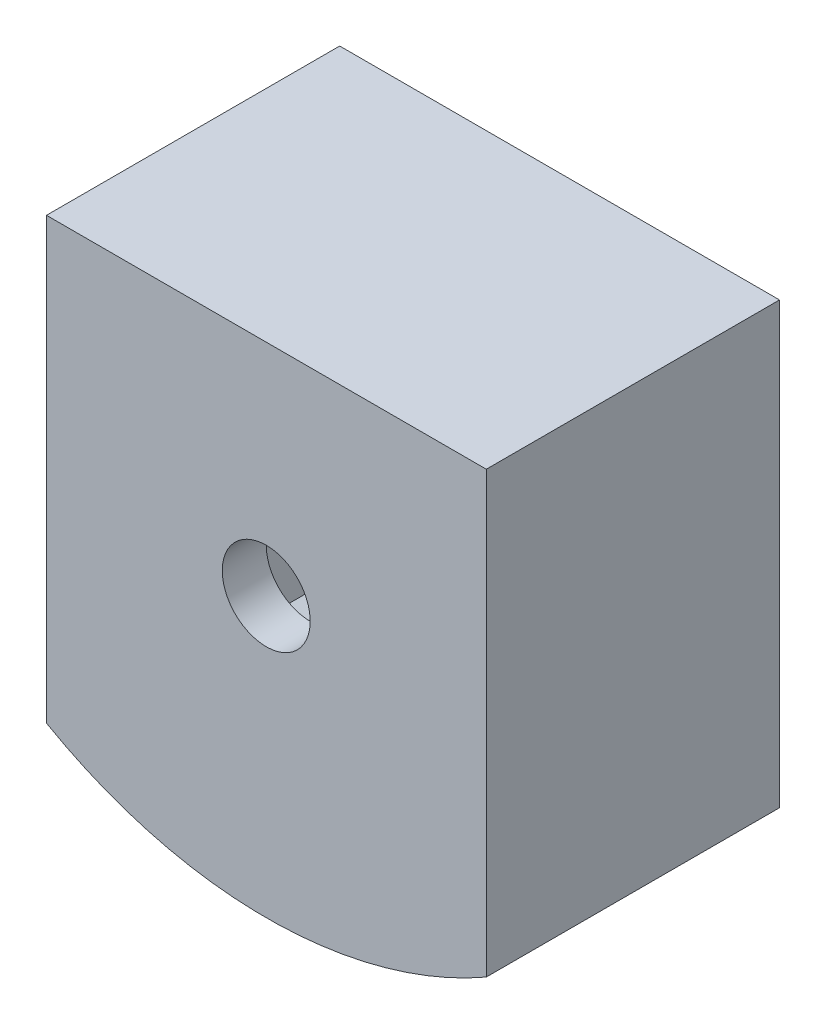
ISO-10303-21;
HEADER;
FILE_DESCRIPTION(('STEP AP214'),'2;1');
FILE_NAME('part.step','',(''),(''),'','','');
FILE_SCHEMA(('AUTOMOTIVE_DESIGN { 1 0 10303 214 1 1 1 1 }'));
ENDSEC;
DATA;
#1=APPLICATION_CONTEXT('core data for automotive mechanical design processes');
#2=APPLICATION_PROTOCOL_DEFINITION('international standard','automotive_design',2000,#1);
#3=PRODUCT_CONTEXT('',#1,'mechanical');
#4=PRODUCT('Part','Part','',(#3));
#5=PRODUCT_RELATED_PRODUCT_CATEGORY('part','',(#4));
#6=PRODUCT_DEFINITION_FORMATION('','',#4);
#7=PRODUCT_DEFINITION_CONTEXT('part definition',#1,'design');
#8=PRODUCT_DEFINITION('design','',#6,#7);
#9=PRODUCT_DEFINITION_SHAPE('','',#8);
#10=(LENGTH_UNIT() NAMED_UNIT(*) SI_UNIT(.MILLI.,.METRE.));
#11=(NAMED_UNIT(*) PLANE_ANGLE_UNIT() SI_UNIT($,.RADIAN.));
#12=(NAMED_UNIT(*) SI_UNIT($,.STERADIAN.) SOLID_ANGLE_UNIT());
#13=UNCERTAINTY_MEASURE_WITH_UNIT(LENGTH_MEASURE(1.E-05),#10,'distance_accuracy_value','');
#14=(GEOMETRIC_REPRESENTATION_CONTEXT(3) GLOBAL_UNCERTAINTY_ASSIGNED_CONTEXT((#13)) GLOBAL_UNIT_ASSIGNED_CONTEXT((#10,
#11,#12)) REPRESENTATION_CONTEXT('',''));
#15=CARTESIAN_POINT('',(0.,0.,0.));
#16=DIRECTION('',(0.,0.,1.));
#17=DIRECTION('',(1.,0.,0.));
#18=AXIS2_PLACEMENT_3D('',#15,#16,#17);
#19=CARTESIAN_POINT('',(-15.,-15.,20.));
#20=DIRECTION('',(1.,0.,0.));
#21=DIRECTION('',(0.,1.,0.));
#22=AXIS2_PLACEMENT_3D('',#19,#20,#21);
#23=PLANE('',#22);
#24=DIRECTION('',(0.,-1.,0.));
#25=VECTOR('',#24,1.);
#26=CARTESIAN_POINT('',(-15.,-15.,0.));
#27=LINE('',#26,#25);
#28=CARTESIAN_POINT('',(-15.,15.,0.));
#29=VERTEX_POINT('',#28);
#30=CARTESIAN_POINT('',(-15.,-15.,0.));
#31=VERTEX_POINT('',#30);
#32=EDGE_CURVE('E349',#29,#31,#27,.T.);
#33=ORIENTED_EDGE('',*,*,#32,.T.);
#34=DIRECTION('',(0.,0.,-1.));
#35=VECTOR('',#34,1.);
#36=CARTESIAN_POINT('',(-15.,-15.,20.));
#37=LINE('',#36,#35);
#38=CARTESIAN_POINT('',(-15.,-15.,20.));
#39=VERTEX_POINT('',#38);
#40=EDGE_CURVE('E13',#39,#31,#37,.T.);
#41=ORIENTED_EDGE('',*,*,#40,.F.);
#42=DIRECTION('',(0.,-1.,0.));
#43=VECTOR('',#42,1.);
#44=CARTESIAN_POINT('',(-15.,-15.,20.));
#45=LINE('',#44,#43);
#46=CARTESIAN_POINT('',(-15.,15.,20.));
#47=VERTEX_POINT('',#46);
#48=EDGE_CURVE('E377',#47,#39,#45,.T.);
#49=ORIENTED_EDGE('',*,*,#48,.F.);
#50=DIRECTION('',(0.,0.,-1.));
#51=VECTOR('',#50,1.);
#52=CARTESIAN_POINT('',(-15.,15.,20.));
#53=LINE('',#52,#51);
#54=EDGE_CURVE('E387',#47,#29,#53,.T.);
#55=ORIENTED_EDGE('',*,*,#54,.T.);
#56=EDGE_LOOP('',(#33,#41,#49,#55));
#57=FACE_BOUND('',#56,.T.);
#58=ADVANCED_FACE('F47',(#57),#23,.F.);
#59=CARTESIAN_POINT('',(0.,11.0897908705464,20.));
#60=DIRECTION('',(0.,0.,-1.));
#61=DIRECTION('',(-1.,0.,0.));
#62=AXIS2_PLACEMENT_3D('',#59,#60,#61);
#63=CYLINDRICAL_SURFACE('',#62,30.0944710481651);
#64=CARTESIAN_POINT('',(0.,11.0897908705464,0.));
#65=DIRECTION('',(0.,0.,1.));
#66=DIRECTION('',(1.,0.,0.));
#67=AXIS2_PLACEMENT_3D('',#64,#65,#66);
#68=CIRCLE('',#67,30.0944710481651);
#69=CARTESIAN_POINT('',(15.,-15.,0.));
#70=VERTEX_POINT('',#69);
#71=EDGE_CURVE('E390',#31,#70,#68,.T.);
#72=ORIENTED_EDGE('',*,*,#71,.T.);
#73=DIRECTION('',(0.,0.,-1.));
#74=VECTOR('',#73,1.);
#75=CARTESIAN_POINT('',(15.,-15.,20.));
#76=LINE('',#75,#74);
#77=CARTESIAN_POINT('',(15.,-15.,20.));
#78=VERTEX_POINT('',#77);
#79=EDGE_CURVE('E54',#78,#70,#76,.T.);
#80=ORIENTED_EDGE('',*,*,#79,.F.);
#81=CARTESIAN_POINT('',(0.,11.0897908705464,20.));
#82=DIRECTION('',(0.,0.,1.));
#83=DIRECTION('',(1.,0.,0.));
#84=AXIS2_PLACEMENT_3D('',#81,#82,#83);
#85=CIRCLE('',#84,30.0944710481651);
#86=EDGE_CURVE('E380',#39,#78,#85,.T.);
#87=ORIENTED_EDGE('',*,*,#86,.F.);
#88=ORIENTED_EDGE('',*,*,#40,.T.);
#89=EDGE_LOOP('',(#72,#80,#87,#88));
#90=FACE_BOUND('',#89,.T.);
#91=ADVANCED_FACE('F420',(#90),#63,.T.);
#92=CARTESIAN_POINT('',(15.,-15.,20.));
#93=DIRECTION('',(-1.,0.,0.));
#94=DIRECTION('',(0.,-1.,0.));
#95=AXIS2_PLACEMENT_3D('',#92,#93,#94);
#96=PLANE('',#95);
#97=DIRECTION('',(0.,1.,0.));
#98=VECTOR('',#97,1.);
#99=CARTESIAN_POINT('',(15.,-15.,0.));
#100=LINE('',#99,#98);
#101=CARTESIAN_POINT('',(15.,15.,0.));
#102=VERTEX_POINT('',#101);
#103=EDGE_CURVE('E392',#70,#102,#100,.T.);
#104=ORIENTED_EDGE('',*,*,#103,.T.);
#105=DIRECTION('',(0.,0.,-1.));
#106=VECTOR('',#105,1.);
#107=CARTESIAN_POINT('',(15.,15.,20.));
#108=LINE('',#107,#106);
#109=CARTESIAN_POINT('',(15.,15.,20.));
#110=VERTEX_POINT('',#109);
#111=EDGE_CURVE('E397',#110,#102,#108,.T.);
#112=ORIENTED_EDGE('',*,*,#111,.F.);
#113=DIRECTION('',(0.,1.,0.));
#114=VECTOR('',#113,1.);
#115=CARTESIAN_POINT('',(15.,-15.,20.));
#116=LINE('',#115,#114);
#117=EDGE_CURVE('E383',#78,#110,#116,.T.);
#118=ORIENTED_EDGE('',*,*,#117,.F.);
#119=ORIENTED_EDGE('',*,*,#79,.T.);
#120=EDGE_LOOP('',(#104,#112,#118,#119));
#121=FACE_BOUND('',#120,.T.);
#122=ADVANCED_FACE('F404',(#121),#96,.F.);
#123=CARTESIAN_POINT('',(15.,15.,20.));
#124=DIRECTION('',(0.,-1.,0.));
#125=DIRECTION('',(0.,0.,-1.));
#126=AXIS2_PLACEMENT_3D('',#123,#124,#125);
#127=PLANE('',#126);
#128=DIRECTION('',(-1.,0.,0.));
#129=VECTOR('',#128,1.);
#130=CARTESIAN_POINT('',(15.,15.,0.));
#131=LINE('',#130,#129);
#132=EDGE_CURVE('E381',#102,#29,#131,.T.);
#133=ORIENTED_EDGE('',*,*,#132,.T.);
#134=ORIENTED_EDGE('',*,*,#54,.F.);
#135=DIRECTION('',(-1.,0.,0.));
#136=VECTOR('',#135,1.);
#137=CARTESIAN_POINT('',(15.,15.,20.));
#138=LINE('',#137,#136);
#139=EDGE_CURVE('E385',#110,#47,#138,.T.);
#140=ORIENTED_EDGE('',*,*,#139,.F.);
#141=ORIENTED_EDGE('',*,*,#111,.T.);
#142=EDGE_LOOP('',(#133,#134,#140,#141));
#143=FACE_BOUND('',#142,.T.);
#144=ADVANCED_FACE('F413',(#143),#127,.F.);
#145=CARTESIAN_POINT('',(0.,11.0897908705464,20.));
#146=DIRECTION('',(0.,0.,1.));
#147=DIRECTION('',(1.,0.,0.));
#148=AXIS2_PLACEMENT_3D('',#145,#146,#147);
#149=PLANE('',#148);
#150=CARTESIAN_POINT('',(-0.0102597379063596,0.00757269740248034,20.));
#151=DIRECTION('',(0.,0.,-1.));
#152=DIRECTION('',(-1.,0.,0.));
#153=AXIS2_PLACEMENT_3D('',#150,#151,#152);
#154=CIRCLE('',#153,3.);
#155=CARTESIAN_POINT('',(-3.01025973790636,0.00757269740248034,20.));
#156=VERTEX_POINT('',#155);
#157=EDGE_CURVE('E340',#156,#156,#154,.T.);
#158=ORIENTED_EDGE('',*,*,#157,.T.);
#159=EDGE_LOOP('',(#158));
#160=FACE_BOUND('',#159,.T.);
#161=ORIENTED_EDGE('',*,*,#48,.T.);
#162=ORIENTED_EDGE('',*,*,#86,.T.);
#163=ORIENTED_EDGE('',*,*,#117,.T.);
#164=ORIENTED_EDGE('',*,*,#139,.T.);
#165=EDGE_LOOP('',(#161,#162,#163,#164));
#166=FACE_BOUND('',#165,.T.);
#167=ADVANCED_FACE('F419',(#160,#166),#149,.T.);
#168=CARTESIAN_POINT('',(0.,11.0897908705464,0.));
#169=DIRECTION('',(0.,0.,1.));
#170=DIRECTION('',(1.,0.,0.));
#171=AXIS2_PLACEMENT_3D('',#168,#169,#170);
#172=PLANE('',#171);
#173=DIRECTION('',(-1.,0.,0.));
#174=VECTOR('',#173,1.);
#175=CARTESIAN_POINT('',(5.,13.,0.));
#176=LINE('',#175,#174);
#177=CARTESIAN_POINT('',(5.,13.,0.));
#178=VERTEX_POINT('',#177);
#179=CARTESIAN_POINT('',(-5.,13.,0.));
#180=VERTEX_POINT('',#179);
#181=EDGE_CURVE('E236',#178,#180,#176,.T.);
#182=ORIENTED_EDGE('',*,*,#181,.F.);
#183=DIRECTION('',(0.,-1.,0.));
#184=VECTOR('',#183,1.);
#185=CARTESIAN_POINT('',(5.,14.,0.));
#186=LINE('',#185,#184);
#187=CARTESIAN_POINT('',(5.,14.,0.));
#188=VERTEX_POINT('',#187);
#189=EDGE_CURVE('E61',#188,#178,#186,.T.);
#190=ORIENTED_EDGE('',*,*,#189,.F.);
#191=DIRECTION('',(1.,0.,0.));
#192=VECTOR('',#191,1.);
#193=CARTESIAN_POINT('',(5.,14.,0.));
#194=LINE('',#193,#192);
#195=CARTESIAN_POINT('',(-5.,14.,0.));
#196=VERTEX_POINT('',#195);
#197=EDGE_CURVE('E227',#196,#188,#194,.T.);
#198=ORIENTED_EDGE('',*,*,#197,.F.);
#199=DIRECTION('',(0.,1.,0.));
#200=VECTOR('',#199,1.);
#201=CARTESIAN_POINT('',(-5.,14.,0.));
#202=LINE('',#201,#200);
#203=EDGE_CURVE('E230',#180,#196,#202,.T.);
#204=ORIENTED_EDGE('',*,*,#203,.F.);
#205=EDGE_LOOP('',(#182,#190,#198,#204));
#206=FACE_BOUND('',#205,.T.);
#207=DIRECTION('',(-1.,0.,0.));
#208=VECTOR('',#207,1.);
#209=CARTESIAN_POINT('',(14.,-5.,0.));
#210=LINE('',#209,#208);
#211=CARTESIAN_POINT('',(14.,-5.,0.));
#212=VERTEX_POINT('',#211);
#213=CARTESIAN_POINT('',(13.,-5.,0.));
#214=VERTEX_POINT('',#213);
#215=EDGE_CURVE('E262',#212,#214,#210,.T.);
#216=ORIENTED_EDGE('',*,*,#215,.F.);
#217=DIRECTION('',(0.,-1.,0.));
#218=VECTOR('',#217,1.);
#219=CARTESIAN_POINT('',(14.,5.,0.));
#220=LINE('',#219,#218);
#221=CARTESIAN_POINT('',(14.,5.,0.));
#222=VERTEX_POINT('',#221);
#223=EDGE_CURVE('E69',#222,#212,#220,.T.);
#224=ORIENTED_EDGE('',*,*,#223,.F.);
#225=DIRECTION('',(1.,0.,0.));
#226=VECTOR('',#225,1.);
#227=CARTESIAN_POINT('',(14.,5.,0.));
#228=LINE('',#227,#226);
#229=CARTESIAN_POINT('',(13.,5.,0.));
#230=VERTEX_POINT('',#229);
#231=EDGE_CURVE('E251',#230,#222,#228,.T.);
#232=ORIENTED_EDGE('',*,*,#231,.F.);
#233=DIRECTION('',(0.,1.,0.));
#234=VECTOR('',#233,1.);
#235=CARTESIAN_POINT('',(13.,5.,0.));
#236=LINE('',#235,#234);
#237=EDGE_CURVE('E266',#214,#230,#236,.T.);
#238=ORIENTED_EDGE('',*,*,#237,.F.);
#239=EDGE_LOOP('',(#216,#224,#232,#238));
#240=FACE_BOUND('',#239,.T.);
#241=DIRECTION('',(-1.,0.,0.));
#242=VECTOR('',#241,1.);
#243=CARTESIAN_POINT('',(3.5,-18.,0.));
#244=LINE('',#243,#242);
#245=CARTESIAN_POINT('',(3.5,-18.,0.));
#246=VERTEX_POINT('',#245);
#247=CARTESIAN_POINT('',(-3.5,-18.,0.));
#248=VERTEX_POINT('',#247);
#249=EDGE_CURVE('E293',#246,#248,#244,.T.);
#250=ORIENTED_EDGE('',*,*,#249,.F.);
#251=DIRECTION('',(0.,-1.,0.));
#252=VECTOR('',#251,1.);
#253=CARTESIAN_POINT('',(3.5,-17.,0.));
#254=LINE('',#253,#252);
#255=CARTESIAN_POINT('',(3.5,-17.,0.));
#256=VERTEX_POINT('',#255);
#257=EDGE_CURVE('E291',#256,#246,#254,.T.);
#258=ORIENTED_EDGE('',*,*,#257,.F.);
#259=DIRECTION('',(1.,0.,0.));
#260=VECTOR('',#259,1.);
#261=CARTESIAN_POINT('',(3.5,-17.,0.));
#262=LINE('',#261,#260);
#263=CARTESIAN_POINT('',(-3.5,-17.,0.));
#264=VERTEX_POINT('',#263);
#265=EDGE_CURVE('E281',#264,#256,#262,.T.);
#266=ORIENTED_EDGE('',*,*,#265,.F.);
#267=DIRECTION('',(0.,1.,0.));
#268=VECTOR('',#267,1.);
#269=CARTESIAN_POINT('',(-3.5,-17.,0.));
#270=LINE('',#269,#268);
#271=EDGE_CURVE('E297',#248,#264,#270,.T.);
#272=ORIENTED_EDGE('',*,*,#271,.F.);
#273=EDGE_LOOP('',(#250,#258,#266,#272));
#274=FACE_BOUND('',#273,.T.);
#275=DIRECTION('',(-1.,0.,0.));
#276=VECTOR('',#275,1.);
#277=CARTESIAN_POINT('',(-13.,-5.,0.));
#278=LINE('',#277,#276);
#279=CARTESIAN_POINT('',(-13.,-5.,0.));
#280=VERTEX_POINT('',#279);
#281=CARTESIAN_POINT('',(-14.,-5.,0.));
#282=VERTEX_POINT('',#281);
#283=EDGE_CURVE('E325',#280,#282,#278,.T.);
#284=ORIENTED_EDGE('',*,*,#283,.F.);
#285=DIRECTION('',(0.,-1.,0.));
#286=VECTOR('',#285,1.);
#287=CARTESIAN_POINT('',(-13.,5.,0.));
#288=LINE('',#287,#286);
#289=CARTESIAN_POINT('',(-13.,5.,0.));
#290=VERTEX_POINT('',#289);
#291=EDGE_CURVE('E323',#290,#280,#288,.T.);
#292=ORIENTED_EDGE('',*,*,#291,.F.);
#293=DIRECTION('',(1.,0.,0.));
#294=VECTOR('',#293,1.);
#295=CARTESIAN_POINT('',(-13.,5.,0.));
#296=LINE('',#295,#294);
#297=CARTESIAN_POINT('',(-14.,5.,0.));
#298=VERTEX_POINT('',#297);
#299=EDGE_CURVE('E313',#298,#290,#296,.T.);
#300=ORIENTED_EDGE('',*,*,#299,.F.);
#301=DIRECTION('',(0.,1.,0.));
#302=VECTOR('',#301,1.);
#303=CARTESIAN_POINT('',(-14.,5.,0.));
#304=LINE('',#303,#302);
#305=EDGE_CURVE('E328',#282,#298,#304,.T.);
#306=ORIENTED_EDGE('',*,*,#305,.F.);
#307=EDGE_LOOP('',(#284,#292,#300,#306));
#308=FACE_BOUND('',#307,.T.);
#309=DIRECTION('',(-1.,0.,0.));
#310=VECTOR('',#309,1.);
#311=CARTESIAN_POINT('',(15.,12.,0.));
#312=LINE('',#311,#310);
#313=CARTESIAN_POINT('',(12.,12.,0.));
#314=VERTEX_POINT('',#313);
#315=CARTESIAN_POINT('',(-12.,12.,0.));
#316=VERTEX_POINT('',#315);
#317=EDGE_CURVE('E355',#314,#316,#312,.T.);
#318=ORIENTED_EDGE('',*,*,#317,.T.);
#319=DIRECTION('',(0.,-1.,0.));
#320=VECTOR('',#319,1.);
#321=CARTESIAN_POINT('',(-12.,-15.,0.));
#322=LINE('',#321,#320);
#323=CARTESIAN_POINT('',(-12.,-13.2023963792641,0.));
#324=VERTEX_POINT('',#323);
#325=EDGE_CURVE('E343',#316,#324,#322,.T.);
#326=ORIENTED_EDGE('',*,*,#325,.T.);
#327=CARTESIAN_POINT('',(0.,11.0897908705464,0.));
#328=DIRECTION('',(0.,0.,1.));
#329=DIRECTION('',(1.,0.,0.));
#330=AXIS2_PLACEMENT_3D('',#327,#328,#329);
#331=CIRCLE('',#330,27.0944710481651);
#332=CARTESIAN_POINT('',(12.,-13.2023963792641,0.));
#333=VERTEX_POINT('',#332);
#334=EDGE_CURVE('E369',#324,#333,#331,.T.);
#335=ORIENTED_EDGE('',*,*,#334,.T.);
#336=DIRECTION('',(0.,1.,0.));
#337=VECTOR('',#336,1.);
#338=CARTESIAN_POINT('',(12.,-15.,0.));
#339=LINE('',#338,#337);
#340=EDGE_CURVE('E372',#333,#314,#339,.T.);
#341=ORIENTED_EDGE('',*,*,#340,.T.);
#342=EDGE_LOOP('',(#318,#326,#335,#341));
#343=FACE_BOUND('',#342,.T.);
#344=ORIENTED_EDGE('',*,*,#32,.F.);
#345=ORIENTED_EDGE('',*,*,#132,.F.);
#346=ORIENTED_EDGE('',*,*,#103,.F.);
#347=ORIENTED_EDGE('',*,*,#71,.F.);
#348=EDGE_LOOP('',(#344,#345,#346,#347));
#349=FACE_BOUND('',#348,.T.);
#350=ADVANCED_FACE('F410',(#206,#240,#274,#308,#343,#349),#172,.F.);
#351=CARTESIAN_POINT('',(-12.,-15.,20.));
#352=DIRECTION('',(1.,0.,0.));
#353=DIRECTION('',(0.,1.,0.));
#354=AXIS2_PLACEMENT_3D('',#351,#352,#353);
#355=PLANE('',#354);
#356=ORIENTED_EDGE('',*,*,#325,.F.);
#357=DIRECTION('',(0.,0.,-1.));
#358=VECTOR('',#357,1.);
#359=CARTESIAN_POINT('',(-12.,12.,20.));
#360=LINE('',#359,#358);
#361=CARTESIAN_POINT('',(-12.,12.,17.));
#362=VERTEX_POINT('',#361);
#363=EDGE_CURVE('E356',#362,#316,#360,.T.);
#364=ORIENTED_EDGE('',*,*,#363,.F.);
#365=DIRECTION('',(0.,-1.,0.));
#366=VECTOR('',#365,1.);
#367=CARTESIAN_POINT('',(-12.,-15.,17.));
#368=LINE('',#367,#366);
#369=CARTESIAN_POINT('',(-12.,-13.2023963792641,17.));
#370=VERTEX_POINT('',#369);
#371=EDGE_CURVE('E351',#362,#370,#368,.T.);
#372=ORIENTED_EDGE('',*,*,#371,.T.);
#373=DIRECTION('',(0.,0.,-1.));
#374=VECTOR('',#373,1.);
#375=CARTESIAN_POINT('',(-12.,-13.2023963792641,17.));
#376=LINE('',#375,#374);
#377=EDGE_CURVE('E346',#370,#324,#376,.T.);
#378=ORIENTED_EDGE('',*,*,#377,.T.);
#379=EDGE_LOOP('',(#356,#364,#372,#378));
#380=FACE_BOUND('',#379,.T.);
#381=ADVANCED_FACE('F432',(#380),#355,.T.);
#382=CARTESIAN_POINT('',(0.,11.0897908705464,20.));
#383=DIRECTION('',(0.,0.,-1.));
#384=DIRECTION('',(-1.,0.,0.));
#385=AXIS2_PLACEMENT_3D('',#382,#383,#384);
#386=CYLINDRICAL_SURFACE('',#385,27.0944710481651);
#387=ORIENTED_EDGE('',*,*,#334,.F.);
#388=ORIENTED_EDGE('',*,*,#377,.F.);
#389=CARTESIAN_POINT('',(0.,11.0897908705464,17.));
#390=DIRECTION('',(0.,0.,1.));
#391=DIRECTION('',(1.,0.,0.));
#392=AXIS2_PLACEMENT_3D('',#389,#390,#391);
#393=CIRCLE('',#392,27.0944710481651);
#394=CARTESIAN_POINT('',(12.,-13.2023963792641,17.));
#395=VERTEX_POINT('',#394);
#396=EDGE_CURVE('E354',#370,#395,#393,.T.);
#397=ORIENTED_EDGE('',*,*,#396,.T.);
#398=DIRECTION('',(0.,0.,-1.));
#399=VECTOR('',#398,1.);
#400=CARTESIAN_POINT('',(12.,-13.2023963792641,17.));
#401=LINE('',#400,#399);
#402=EDGE_CURVE('E350',#395,#333,#401,.T.);
#403=ORIENTED_EDGE('',*,*,#402,.T.);
#404=EDGE_LOOP('',(#387,#388,#397,#403));
#405=FACE_BOUND('',#404,.T.);
#406=ADVANCED_FACE('F449',(#405),#386,.F.);
#407=CARTESIAN_POINT('',(12.,-15.,20.));
#408=DIRECTION('',(-1.,0.,0.));
#409=DIRECTION('',(0.,-1.,0.));
#410=AXIS2_PLACEMENT_3D('',#407,#408,#409);
#411=PLANE('',#410);
#412=ORIENTED_EDGE('',*,*,#340,.F.);
#413=ORIENTED_EDGE('',*,*,#402,.F.);
#414=DIRECTION('',(0.,1.,0.));
#415=VECTOR('',#414,1.);
#416=CARTESIAN_POINT('',(12.,-15.,17.));
#417=LINE('',#416,#415);
#418=CARTESIAN_POINT('',(12.,12.,17.));
#419=VERTEX_POINT('',#418);
#420=EDGE_CURVE('E363',#395,#419,#417,.T.);
#421=ORIENTED_EDGE('',*,*,#420,.T.);
#422=DIRECTION('',(0.,0.,-1.));
#423=VECTOR('',#422,1.);
#424=CARTESIAN_POINT('',(12.,12.,20.));
#425=LINE('',#424,#423);
#426=EDGE_CURVE('E358',#419,#314,#425,.T.);
#427=ORIENTED_EDGE('',*,*,#426,.T.);
#428=EDGE_LOOP('',(#412,#413,#421,#427));
#429=FACE_BOUND('',#428,.T.);
#430=ADVANCED_FACE('F445',(#429),#411,.T.);
#431=CARTESIAN_POINT('',(15.,12.,20.));
#432=DIRECTION('',(0.,-1.,0.));
#433=DIRECTION('',(0.,0.,-1.));
#434=AXIS2_PLACEMENT_3D('',#431,#432,#433);
#435=PLANE('',#434);
#436=ORIENTED_EDGE('',*,*,#317,.F.);
#437=ORIENTED_EDGE('',*,*,#426,.F.);
#438=DIRECTION('',(-1.,0.,0.));
#439=VECTOR('',#438,1.);
#440=CARTESIAN_POINT('',(15.,12.,17.));
#441=LINE('',#440,#439);
#442=EDGE_CURVE('E359',#419,#362,#441,.T.);
#443=ORIENTED_EDGE('',*,*,#442,.T.);
#444=ORIENTED_EDGE('',*,*,#363,.T.);
#445=EDGE_LOOP('',(#436,#437,#443,#444));
#446=FACE_BOUND('',#445,.T.);
#447=ADVANCED_FACE('F441',(#446),#435,.T.);
#448=CARTESIAN_POINT('',(0.,11.0897908705464,17.));
#449=DIRECTION('',(0.,0.,1.));
#450=DIRECTION('',(1.,0.,0.));
#451=AXIS2_PLACEMENT_3D('',#448,#449,#450);
#452=PLANE('',#451);
#453=CARTESIAN_POINT('',(-0.0102597379063596,0.00757269740248034,17.));
#454=DIRECTION('',(0.,0.,-1.));
#455=DIRECTION('',(-1.,0.,0.));
#456=AXIS2_PLACEMENT_3D('',#453,#454,#455);
#457=CIRCLE('',#456,3.);
#458=CARTESIAN_POINT('',(-3.01025973790636,0.00757269740248034,17.));
#459=VERTEX_POINT('',#458);
#460=EDGE_CURVE('E243',#459,#459,#457,.T.);
#461=ORIENTED_EDGE('',*,*,#460,.F.);
#462=EDGE_LOOP('',(#461));
#463=FACE_BOUND('',#462,.T.);
#464=ORIENTED_EDGE('',*,*,#371,.F.);
#465=ORIENTED_EDGE('',*,*,#442,.F.);
#466=ORIENTED_EDGE('',*,*,#420,.F.);
#467=ORIENTED_EDGE('',*,*,#396,.F.);
#468=EDGE_LOOP('',(#464,#465,#466,#467));
#469=FACE_BOUND('',#468,.T.);
#470=ADVANCED_FACE('F437',(#463,#469),#452,.F.);
#471=CARTESIAN_POINT('',(-0.0102597379063596,0.00757269740248034,20.));
#472=DIRECTION('',(0.,0.,-1.));
#473=DIRECTION('',(-1.,0.,0.));
#474=AXIS2_PLACEMENT_3D('',#471,#472,#473);
#475=CYLINDRICAL_SURFACE('',#474,3.);
#476=ORIENTED_EDGE('',*,*,#157,.F.);
#477=EDGE_LOOP('',(#476));
#478=FACE_BOUND('',#477,.T.);
#479=ORIENTED_EDGE('',*,*,#460,.T.);
#480=EDGE_LOOP('',(#479));
#481=FACE_BOUND('',#480,.T.);
#482=ADVANCED_FACE('F440',(#478,#481),#475,.F.);
#483=CARTESIAN_POINT('',(-13.,5.,5.));
#484=DIRECTION('',(1.,0.,0.));
#485=DIRECTION('',(0.,0.,-1.));
#486=AXIS2_PLACEMENT_3D('',#483,#484,#485);
#487=PLANE('',#486);
#488=ORIENTED_EDGE('',*,*,#291,.T.);
#489=DIRECTION('',(0.,0.,-1.));
#490=VECTOR('',#489,1.);
#491=CARTESIAN_POINT('',(-13.,-5.,5.));
#492=LINE('',#491,#490);
#493=CARTESIAN_POINT('',(-13.,-5.,5.));
#494=VERTEX_POINT('',#493);
#495=EDGE_CURVE('E322',#494,#280,#492,.T.);
#496=ORIENTED_EDGE('',*,*,#495,.F.);
#497=DIRECTION('',(0.,-1.,0.));
#498=VECTOR('',#497,1.);
#499=CARTESIAN_POINT('',(-13.,5.,5.));
#500=LINE('',#499,#498);
#501=CARTESIAN_POINT('',(-13.,5.,5.));
#502=VERTEX_POINT('',#501);
#503=EDGE_CURVE('E309',#502,#494,#500,.T.);
#504=ORIENTED_EDGE('',*,*,#503,.F.);
#505=DIRECTION('',(0.,0.,-1.));
#506=VECTOR('',#505,1.);
#507=CARTESIAN_POINT('',(-13.,5.,5.));
#508=LINE('',#507,#506);
#509=EDGE_CURVE('E294',#502,#290,#508,.T.);
#510=ORIENTED_EDGE('',*,*,#509,.T.);
#511=EDGE_LOOP('',(#488,#496,#504,#510));
#512=FACE_BOUND('',#511,.T.);
#513=ADVANCED_FACE('F459',(#512),#487,.F.);
#514=CARTESIAN_POINT('',(-13.,5.,5.));
#515=DIRECTION('',(0.,1.,0.));
#516=DIRECTION('',(0.,0.,1.));
#517=AXIS2_PLACEMENT_3D('',#514,#515,#516);
#518=PLANE('',#517);
#519=ORIENTED_EDGE('',*,*,#299,.T.);
#520=ORIENTED_EDGE('',*,*,#509,.F.);
#521=DIRECTION('',(1.,0.,0.));
#522=VECTOR('',#521,1.);
#523=CARTESIAN_POINT('',(-13.,5.,5.));
#524=LINE('',#523,#522);
#525=CARTESIAN_POINT('',(-14.,5.,5.));
#526=VERTEX_POINT('',#525);
#527=EDGE_CURVE('E319',#526,#502,#524,.T.);
#528=ORIENTED_EDGE('',*,*,#527,.F.);
#529=DIRECTION('',(0.,0.,-1.));
#530=VECTOR('',#529,1.);
#531=CARTESIAN_POINT('',(-14.,5.,5.));
#532=LINE('',#531,#530);
#533=EDGE_CURVE('E334',#526,#298,#532,.T.);
#534=ORIENTED_EDGE('',*,*,#533,.T.);
#535=EDGE_LOOP('',(#519,#520,#528,#534));
#536=FACE_BOUND('',#535,.T.);
#537=ADVANCED_FACE('F463',(#536),#518,.F.);
#538=CARTESIAN_POINT('',(-14.,5.,5.));
#539=DIRECTION('',(-1.,0.,0.));
#540=DIRECTION('',(0.,0.,1.));
#541=AXIS2_PLACEMENT_3D('',#538,#539,#540);
#542=PLANE('',#541);
#543=ORIENTED_EDGE('',*,*,#305,.T.);
#544=ORIENTED_EDGE('',*,*,#533,.F.);
#545=DIRECTION('',(0.,1.,0.));
#546=VECTOR('',#545,1.);
#547=CARTESIAN_POINT('',(-14.,5.,5.));
#548=LINE('',#547,#546);
#549=CARTESIAN_POINT('',(-14.,-5.,5.));
#550=VERTEX_POINT('',#549);
#551=EDGE_CURVE('E316',#550,#526,#548,.T.);
#552=ORIENTED_EDGE('',*,*,#551,.F.);
#553=DIRECTION('',(0.,0.,-1.));
#554=VECTOR('',#553,1.);
#555=CARTESIAN_POINT('',(-14.,-5.,5.));
#556=LINE('',#555,#554);
#557=EDGE_CURVE('E336',#550,#282,#556,.T.);
#558=ORIENTED_EDGE('',*,*,#557,.T.);
#559=EDGE_LOOP('',(#543,#544,#552,#558));
#560=FACE_BOUND('',#559,.T.);
#561=ADVANCED_FACE('F469',(#560),#542,.F.);
#562=CARTESIAN_POINT('',(-13.,-5.,5.));
#563=DIRECTION('',(0.,-1.,0.));
#564=DIRECTION('',(0.,0.,-1.));
#565=AXIS2_PLACEMENT_3D('',#562,#563,#564);
#566=PLANE('',#565);
#567=ORIENTED_EDGE('',*,*,#283,.T.);
#568=ORIENTED_EDGE('',*,*,#557,.F.);
#569=DIRECTION('',(-1.,0.,0.));
#570=VECTOR('',#569,1.);
#571=CARTESIAN_POINT('',(-13.,-5.,5.));
#572=LINE('',#571,#570);
#573=EDGE_CURVE('E312',#494,#550,#572,.T.);
#574=ORIENTED_EDGE('',*,*,#573,.F.);
#575=ORIENTED_EDGE('',*,*,#495,.T.);
#576=EDGE_LOOP('',(#567,#568,#574,#575));
#577=FACE_BOUND('',#576,.T.);
#578=ADVANCED_FACE('F465',(#577),#566,.F.);
#579=CARTESIAN_POINT('',(0.,0.,5.));
#580=DIRECTION('',(0.,0.,-1.));
#581=DIRECTION('',(-1.,0.,0.));
#582=AXIS2_PLACEMENT_3D('',#579,#580,#581);
#583=PLANE('',#582);
#584=ORIENTED_EDGE('',*,*,#503,.T.);
#585=ORIENTED_EDGE('',*,*,#573,.T.);
#586=ORIENTED_EDGE('',*,*,#551,.T.);
#587=ORIENTED_EDGE('',*,*,#527,.T.);
#588=EDGE_LOOP('',(#584,#585,#586,#587));
#589=FACE_BOUND('',#588,.T.);
#590=ADVANCED_FACE('F468',(#589),#583,.T.);
#591=CARTESIAN_POINT('',(3.5,-17.,5.));
#592=DIRECTION('',(1.,0.,0.));
#593=DIRECTION('',(0.,0.,-1.));
#594=AXIS2_PLACEMENT_3D('',#591,#592,#593);
#595=PLANE('',#594);
#596=ORIENTED_EDGE('',*,*,#257,.T.);
#597=DIRECTION('',(0.,0.,-1.));
#598=VECTOR('',#597,1.);
#599=CARTESIAN_POINT('',(3.5,-18.,5.));
#600=LINE('',#599,#598);
#601=CARTESIAN_POINT('',(3.5,-18.,5.));
#602=VERTEX_POINT('',#601);
#603=EDGE_CURVE('E290',#602,#246,#600,.T.);
#604=ORIENTED_EDGE('',*,*,#603,.F.);
#605=DIRECTION('',(0.,-1.,0.));
#606=VECTOR('',#605,1.);
#607=CARTESIAN_POINT('',(3.5,-17.,5.));
#608=LINE('',#607,#606);
#609=CARTESIAN_POINT('',(3.5,-17.,5.));
#610=VERTEX_POINT('',#609);
#611=EDGE_CURVE('E277',#610,#602,#608,.T.);
#612=ORIENTED_EDGE('',*,*,#611,.F.);
#613=DIRECTION('',(0.,0.,-1.));
#614=VECTOR('',#613,1.);
#615=CARTESIAN_POINT('',(3.5,-17.,5.));
#616=LINE('',#615,#614);
#617=EDGE_CURVE('E263',#610,#256,#616,.T.);
#618=ORIENTED_EDGE('',*,*,#617,.T.);
#619=EDGE_LOOP('',(#596,#604,#612,#618));
#620=FACE_BOUND('',#619,.T.);
#621=ADVANCED_FACE('F479',(#620),#595,.F.);
#622=CARTESIAN_POINT('',(3.5,-17.,5.));
#623=DIRECTION('',(0.,1.,0.));
#624=DIRECTION('',(0.,0.,1.));
#625=AXIS2_PLACEMENT_3D('',#622,#623,#624);
#626=PLANE('',#625);
#627=ORIENTED_EDGE('',*,*,#265,.T.);
#628=ORIENTED_EDGE('',*,*,#617,.F.);
#629=DIRECTION('',(1.,0.,0.));
#630=VECTOR('',#629,1.);
#631=CARTESIAN_POINT('',(3.5,-17.,5.));
#632=LINE('',#631,#630);
#633=CARTESIAN_POINT('',(-3.5,-17.,5.));
#634=VERTEX_POINT('',#633);
#635=EDGE_CURVE('E287',#634,#610,#632,.T.);
#636=ORIENTED_EDGE('',*,*,#635,.F.);
#637=DIRECTION('',(0.,0.,-1.));
#638=VECTOR('',#637,1.);
#639=CARTESIAN_POINT('',(-3.5,-17.,5.));
#640=LINE('',#639,#638);
#641=EDGE_CURVE('E303',#634,#264,#640,.T.);
#642=ORIENTED_EDGE('',*,*,#641,.T.);
#643=EDGE_LOOP('',(#627,#628,#636,#642));
#644=FACE_BOUND('',#643,.T.);
#645=ADVANCED_FACE('F483',(#644),#626,.F.);
#646=CARTESIAN_POINT('',(-3.5,-17.,5.));
#647=DIRECTION('',(-1.,0.,0.));
#648=DIRECTION('',(0.,0.,1.));
#649=AXIS2_PLACEMENT_3D('',#646,#647,#648);
#650=PLANE('',#649);
#651=ORIENTED_EDGE('',*,*,#271,.T.);
#652=ORIENTED_EDGE('',*,*,#641,.F.);
#653=DIRECTION('',(0.,1.,0.));
#654=VECTOR('',#653,1.);
#655=CARTESIAN_POINT('',(-3.5,-17.,5.));
#656=LINE('',#655,#654);
#657=CARTESIAN_POINT('',(-3.5,-18.,5.));
#658=VERTEX_POINT('',#657);
#659=EDGE_CURVE('E284',#658,#634,#656,.T.);
#660=ORIENTED_EDGE('',*,*,#659,.F.);
#661=DIRECTION('',(0.,0.,-1.));
#662=VECTOR('',#661,1.);
#663=CARTESIAN_POINT('',(-3.5,-18.,5.));
#664=LINE('',#663,#662);
#665=EDGE_CURVE('E305',#658,#248,#664,.T.);
#666=ORIENTED_EDGE('',*,*,#665,.T.);
#667=EDGE_LOOP('',(#651,#652,#660,#666));
#668=FACE_BOUND('',#667,.T.);
#669=ADVANCED_FACE('F489',(#668),#650,.F.);
#670=CARTESIAN_POINT('',(3.5,-18.,5.));
#671=DIRECTION('',(0.,-1.,0.));
#672=DIRECTION('',(0.,0.,-1.));
#673=AXIS2_PLACEMENT_3D('',#670,#671,#672);
#674=PLANE('',#673);
#675=ORIENTED_EDGE('',*,*,#249,.T.);
#676=ORIENTED_EDGE('',*,*,#665,.F.);
#677=DIRECTION('',(-1.,0.,0.));
#678=VECTOR('',#677,1.);
#679=CARTESIAN_POINT('',(3.5,-18.,5.));
#680=LINE('',#679,#678);
#681=EDGE_CURVE('E280',#602,#658,#680,.T.);
#682=ORIENTED_EDGE('',*,*,#681,.F.);
#683=ORIENTED_EDGE('',*,*,#603,.T.);
#684=EDGE_LOOP('',(#675,#676,#682,#683));
#685=FACE_BOUND('',#684,.T.);
#686=ADVANCED_FACE('F485',(#685),#674,.F.);
#687=CARTESIAN_POINT('',(0.,0.,5.));
#688=DIRECTION('',(0.,0.,-1.));
#689=DIRECTION('',(-1.,0.,0.));
#690=AXIS2_PLACEMENT_3D('',#687,#688,#689);
#691=PLANE('',#690);
#692=ORIENTED_EDGE('',*,*,#611,.T.);
#693=ORIENTED_EDGE('',*,*,#681,.T.);
#694=ORIENTED_EDGE('',*,*,#659,.T.);
#695=ORIENTED_EDGE('',*,*,#635,.T.);
#696=EDGE_LOOP('',(#692,#693,#694,#695));
#697=FACE_BOUND('',#696,.T.);
#698=ADVANCED_FACE('F488',(#697),#691,.T.);
#699=CARTESIAN_POINT('',(14.,5.,5.));
#700=DIRECTION('',(1.,0.,0.));
#701=DIRECTION('',(0.,0.,-1.));
#702=AXIS2_PLACEMENT_3D('',#699,#700,#701);
#703=PLANE('',#702);
#704=ORIENTED_EDGE('',*,*,#223,.T.);
#705=DIRECTION('',(0.,0.,-1.));
#706=VECTOR('',#705,1.);
#707=CARTESIAN_POINT('',(14.,-5.,5.));
#708=LINE('',#707,#706);
#709=CARTESIAN_POINT('',(14.,-5.,5.));
#710=VERTEX_POINT('',#709);
#711=EDGE_CURVE('E260',#710,#212,#708,.T.);
#712=ORIENTED_EDGE('',*,*,#711,.F.);
#713=DIRECTION('',(0.,-1.,0.));
#714=VECTOR('',#713,1.);
#715=CARTESIAN_POINT('',(14.,5.,5.));
#716=LINE('',#715,#714);
#717=CARTESIAN_POINT('',(14.,5.,5.));
#718=VERTEX_POINT('',#717);
#719=EDGE_CURVE('E247',#718,#710,#716,.T.);
#720=ORIENTED_EDGE('',*,*,#719,.F.);
#721=DIRECTION('',(0.,0.,-1.));
#722=VECTOR('',#721,1.);
#723=CARTESIAN_POINT('',(14.,5.,5.));
#724=LINE('',#723,#722);
#725=EDGE_CURVE('E237',#718,#222,#724,.T.);
#726=ORIENTED_EDGE('',*,*,#725,.T.);
#727=EDGE_LOOP('',(#704,#712,#720,#726));
#728=FACE_BOUND('',#727,.T.);
#729=ADVANCED_FACE('F499',(#728),#703,.F.);
#730=CARTESIAN_POINT('',(14.,5.,5.));
#731=DIRECTION('',(0.,1.,0.));
#732=DIRECTION('',(0.,0.,1.));
#733=AXIS2_PLACEMENT_3D('',#730,#731,#732);
#734=PLANE('',#733);
#735=ORIENTED_EDGE('',*,*,#231,.T.);
#736=ORIENTED_EDGE('',*,*,#725,.F.);
#737=DIRECTION('',(1.,0.,0.));
#738=VECTOR('',#737,1.);
#739=CARTESIAN_POINT('',(14.,5.,5.));
#740=LINE('',#739,#738);
#741=CARTESIAN_POINT('',(13.,5.,5.));
#742=VERTEX_POINT('',#741);
#743=EDGE_CURVE('E257',#742,#718,#740,.T.);
#744=ORIENTED_EDGE('',*,*,#743,.F.);
#745=DIRECTION('',(0.,0.,-1.));
#746=VECTOR('',#745,1.);
#747=CARTESIAN_POINT('',(13.,5.,5.));
#748=LINE('',#747,#746);
#749=EDGE_CURVE('E272',#742,#230,#748,.T.);
#750=ORIENTED_EDGE('',*,*,#749,.T.);
#751=EDGE_LOOP('',(#735,#736,#744,#750));
#752=FACE_BOUND('',#751,.T.);
#753=ADVANCED_FACE('F503',(#752),#734,.F.);
#754=CARTESIAN_POINT('',(13.,5.,5.));
#755=DIRECTION('',(-1.,0.,0.));
#756=DIRECTION('',(0.,0.,1.));
#757=AXIS2_PLACEMENT_3D('',#754,#755,#756);
#758=PLANE('',#757);
#759=ORIENTED_EDGE('',*,*,#237,.T.);
#760=ORIENTED_EDGE('',*,*,#749,.F.);
#761=DIRECTION('',(0.,1.,0.));
#762=VECTOR('',#761,1.);
#763=CARTESIAN_POINT('',(13.,5.,5.));
#764=LINE('',#763,#762);
#765=CARTESIAN_POINT('',(13.,-5.,5.));
#766=VERTEX_POINT('',#765);
#767=EDGE_CURVE('E254',#766,#742,#764,.T.);
#768=ORIENTED_EDGE('',*,*,#767,.F.);
#769=DIRECTION('',(0.,0.,-1.));
#770=VECTOR('',#769,1.);
#771=CARTESIAN_POINT('',(13.,-5.,5.));
#772=LINE('',#771,#770);
#773=EDGE_CURVE('E274',#766,#214,#772,.T.);
#774=ORIENTED_EDGE('',*,*,#773,.T.);
#775=EDGE_LOOP('',(#759,#760,#768,#774));
#776=FACE_BOUND('',#775,.T.);
#777=ADVANCED_FACE('F508',(#776),#758,.F.);
#778=CARTESIAN_POINT('',(14.,-5.,5.));
#779=DIRECTION('',(0.,-1.,0.));
#780=DIRECTION('',(0.,0.,-1.));
#781=AXIS2_PLACEMENT_3D('',#778,#779,#780);
#782=PLANE('',#781);
#783=ORIENTED_EDGE('',*,*,#215,.T.);
#784=ORIENTED_EDGE('',*,*,#773,.F.);
#785=DIRECTION('',(-1.,0.,0.));
#786=VECTOR('',#785,1.);
#787=CARTESIAN_POINT('',(14.,-5.,5.));
#788=LINE('',#787,#786);
#789=EDGE_CURVE('E250',#710,#766,#788,.T.);
#790=ORIENTED_EDGE('',*,*,#789,.F.);
#791=ORIENTED_EDGE('',*,*,#711,.T.);
#792=EDGE_LOOP('',(#783,#784,#790,#791));
#793=FACE_BOUND('',#792,.T.);
#794=ADVANCED_FACE('F504',(#793),#782,.F.);
#795=CARTESIAN_POINT('',(0.,0.,5.));
#796=DIRECTION('',(0.,0.,-1.));
#797=DIRECTION('',(-1.,0.,0.));
#798=AXIS2_PLACEMENT_3D('',#795,#796,#797);
#799=PLANE('',#798);
#800=ORIENTED_EDGE('',*,*,#719,.T.);
#801=ORIENTED_EDGE('',*,*,#789,.T.);
#802=ORIENTED_EDGE('',*,*,#767,.T.);
#803=ORIENTED_EDGE('',*,*,#743,.T.);
#804=EDGE_LOOP('',(#800,#801,#802,#803));
#805=FACE_BOUND('',#804,.T.);
#806=ADVANCED_FACE('F507',(#805),#799,.T.);
#807=CARTESIAN_POINT('',(5.,14.,5.));
#808=DIRECTION('',(1.,0.,0.));
#809=DIRECTION('',(0.,0.,-1.));
#810=AXIS2_PLACEMENT_3D('',#807,#808,#809);
#811=PLANE('',#810);
#812=ORIENTED_EDGE('',*,*,#189,.T.);
#813=DIRECTION('',(0.,0.,-1.));
#814=VECTOR('',#813,1.);
#815=CARTESIAN_POINT('',(5.,13.,5.));
#816=LINE('',#815,#814);
#817=CARTESIAN_POINT('',(5.,13.,5.));
#818=VERTEX_POINT('',#817);
#819=EDGE_CURVE('E205',#818,#178,#816,.T.);
#820=ORIENTED_EDGE('',*,*,#819,.F.);
#821=DIRECTION('',(0.,-1.,0.));
#822=VECTOR('',#821,1.);
#823=CARTESIAN_POINT('',(5.,14.,5.));
#824=LINE('',#823,#822);
#825=CARTESIAN_POINT('',(5.,14.,5.));
#826=VERTEX_POINT('',#825);
#827=EDGE_CURVE('E209',#826,#818,#824,.T.);
#828=ORIENTED_EDGE('',*,*,#827,.F.);
#829=DIRECTION('',(0.,0.,-1.));
#830=VECTOR('',#829,1.);
#831=CARTESIAN_POINT('',(5.,14.,5.));
#832=LINE('',#831,#830);
#833=EDGE_CURVE('E241',#826,#188,#832,.T.);
#834=ORIENTED_EDGE('',*,*,#833,.T.);
#835=EDGE_LOOP('',(#812,#820,#828,#834));
#836=FACE_BOUND('',#835,.T.);
#837=ADVANCED_FACE('F207',(#836),#811,.F.);
#838=CARTESIAN_POINT('',(5.,14.,5.));
#839=DIRECTION('',(0.,1.,0.));
#840=DIRECTION('',(0.,0.,1.));
#841=AXIS2_PLACEMENT_3D('',#838,#839,#840);
#842=PLANE('',#841);
#843=ORIENTED_EDGE('',*,*,#197,.T.);
#844=ORIENTED_EDGE('',*,*,#833,.F.);
#845=DIRECTION('',(1.,0.,0.));
#846=VECTOR('',#845,1.);
#847=CARTESIAN_POINT('',(5.,14.,5.));
#848=LINE('',#847,#846);
#849=CARTESIAN_POINT('',(-5.,14.,5.));
#850=VERTEX_POINT('',#849);
#851=EDGE_CURVE('E215',#850,#826,#848,.T.);
#852=ORIENTED_EDGE('',*,*,#851,.F.);
#853=DIRECTION('',(0.,0.,-1.));
#854=VECTOR('',#853,1.);
#855=CARTESIAN_POINT('',(-5.,14.,5.));
#856=LINE('',#855,#854);
#857=EDGE_CURVE('E244',#850,#196,#856,.T.);
#858=ORIENTED_EDGE('',*,*,#857,.T.);
#859=EDGE_LOOP('',(#843,#844,#852,#858));
#860=FACE_BOUND('',#859,.T.);
#861=ADVANCED_FACE('F521',(#860),#842,.F.);
#862=CARTESIAN_POINT('',(-5.,14.,5.));
#863=DIRECTION('',(-1.,0.,0.));
#864=DIRECTION('',(0.,0.,1.));
#865=AXIS2_PLACEMENT_3D('',#862,#863,#864);
#866=PLANE('',#865);
#867=ORIENTED_EDGE('',*,*,#203,.T.);
#868=ORIENTED_EDGE('',*,*,#857,.F.);
#869=DIRECTION('',(0.,1.,0.));
#870=VECTOR('',#869,1.);
#871=CARTESIAN_POINT('',(-5.,14.,5.));
#872=LINE('',#871,#870);
#873=CARTESIAN_POINT('',(-5.,13.,5.));
#874=VERTEX_POINT('',#873);
#875=EDGE_CURVE('E223',#874,#850,#872,.T.);
#876=ORIENTED_EDGE('',*,*,#875,.F.);
#877=DIRECTION('',(0.,0.,-1.));
#878=VECTOR('',#877,1.);
#879=CARTESIAN_POINT('',(-5.,13.,5.));
#880=LINE('',#879,#878);
#881=EDGE_CURVE('E214',#874,#180,#880,.T.);
#882=ORIENTED_EDGE('',*,*,#881,.T.);
#883=EDGE_LOOP('',(#867,#868,#876,#882));
#884=FACE_BOUND('',#883,.T.);
#885=ADVANCED_FACE('F524',(#884),#866,.F.);
#886=CARTESIAN_POINT('',(5.,13.,5.));
#887=DIRECTION('',(0.,-1.,0.));
#888=DIRECTION('',(0.,0.,-1.));
#889=AXIS2_PLACEMENT_3D('',#886,#887,#888);
#890=PLANE('',#889);
#891=ORIENTED_EDGE('',*,*,#181,.T.);
#892=ORIENTED_EDGE('',*,*,#881,.F.);
#893=DIRECTION('',(-1.,0.,0.));
#894=VECTOR('',#893,1.);
#895=CARTESIAN_POINT('',(5.,13.,5.));
#896=LINE('',#895,#894);
#897=EDGE_CURVE('E218',#818,#874,#896,.T.);
#898=ORIENTED_EDGE('',*,*,#897,.F.);
#899=ORIENTED_EDGE('',*,*,#819,.T.);
#900=EDGE_LOOP('',(#891,#892,#898,#899));
#901=FACE_BOUND('',#900,.T.);
#902=ADVANCED_FACE('F219',(#901),#890,.F.);
#903=CARTESIAN_POINT('',(0.,0.,5.));
#904=DIRECTION('',(0.,0.,-1.));
#905=DIRECTION('',(-1.,0.,0.));
#906=AXIS2_PLACEMENT_3D('',#903,#904,#905);
#907=PLANE('',#906);
#908=ORIENTED_EDGE('',*,*,#827,.T.);
#909=ORIENTED_EDGE('',*,*,#897,.T.);
#910=ORIENTED_EDGE('',*,*,#875,.T.);
#911=ORIENTED_EDGE('',*,*,#851,.T.);
#912=EDGE_LOOP('',(#908,#909,#910,#911));
#913=FACE_BOUND('',#912,.T.);
#914=ADVANCED_FACE('F225',(#913),#907,.T.);
#915=CLOSED_SHELL('',(#58,#91,#122,#144,#167,#350,#381,#406,#430,#447,#470,#482,#513,#537,#561,
#578,#590,#621,#645,#669,#686,#698,#729,#753,#777,#794,#806,#837,#861,#885,#902,#914));
#916=MANIFOLD_SOLID_BREP('B2',#915);
#917=ADVANCED_BREP_SHAPE_REPRESENTATION('',(#18,#916),#14);
#918=SHAPE_DEFINITION_REPRESENTATION(#9,#917);
ENDSEC;
END-ISO-10303-21;
